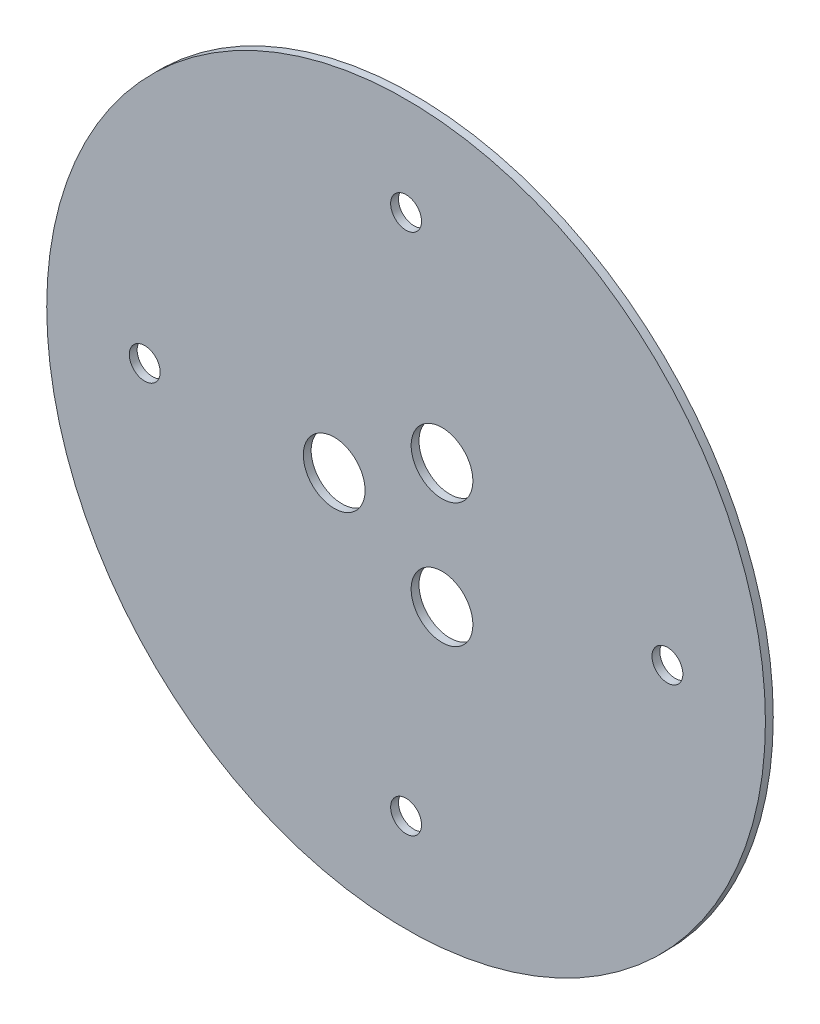
ISO-10303-21;
HEADER;
FILE_DESCRIPTION(('STEP AP214'),'2;1');
FILE_NAME('part.step','',(''),(''),'','','');
FILE_SCHEMA(('AUTOMOTIVE_DESIGN { 1 0 10303 214 1 1 1 1 }'));
ENDSEC;
DATA;
#1=APPLICATION_CONTEXT('core data for automotive mechanical design processes');
#2=APPLICATION_PROTOCOL_DEFINITION('international standard','automotive_design',2000,#1);
#3=PRODUCT_CONTEXT('',#1,'mechanical');
#4=PRODUCT('Part','Part','',(#3));
#5=PRODUCT_RELATED_PRODUCT_CATEGORY('part','',(#4));
#6=PRODUCT_DEFINITION_FORMATION('','',#4);
#7=PRODUCT_DEFINITION_CONTEXT('part definition',#1,'design');
#8=PRODUCT_DEFINITION('design','',#6,#7);
#9=PRODUCT_DEFINITION_SHAPE('','',#8);
#10=(LENGTH_UNIT() NAMED_UNIT(*) SI_UNIT(.MILLI.,.METRE.));
#11=(NAMED_UNIT(*) PLANE_ANGLE_UNIT() SI_UNIT($,.RADIAN.));
#12=(NAMED_UNIT(*) SI_UNIT($,.STERADIAN.) SOLID_ANGLE_UNIT());
#13=UNCERTAINTY_MEASURE_WITH_UNIT(LENGTH_MEASURE(1.E-05),#10,'distance_accuracy_value','');
#14=(GEOMETRIC_REPRESENTATION_CONTEXT(3) GLOBAL_UNCERTAINTY_ASSIGNED_CONTEXT((#13)) GLOBAL_UNIT_ASSIGNED_CONTEXT((#10,
#11,#12)) REPRESENTATION_CONTEXT('',''));
#15=CARTESIAN_POINT('',(0.,0.,0.));
#16=DIRECTION('',(0.,0.,1.));
#17=DIRECTION('',(1.,0.,0.));
#18=AXIS2_PLACEMENT_3D('',#15,#16,#17);
#19=CARTESIAN_POINT('',(0.,0.,1.524));
#20=DIRECTION('',(0.,0.,-1.));
#21=DIRECTION('',(-1.,0.,0.));
#22=AXIS2_PLACEMENT_3D('',#19,#20,#21);
#23=CYLINDRICAL_SURFACE('',#22,69.85);
#24=CARTESIAN_POINT('',(0.,0.,1.524));
#25=DIRECTION('',(0.,0.,1.));
#26=DIRECTION('',(1.,0.,0.));
#27=AXIS2_PLACEMENT_3D('',#24,#25,#26);
#28=CIRCLE('',#27,69.85);
#29=CARTESIAN_POINT('',(-69.85,0.,1.524));
#30=VERTEX_POINT('',#29);
#31=EDGE_CURVE('E10',#30,#30,#28,.T.);
#32=CARTESIAN_POINT('',(0.,0.,0.));
#33=DIRECTION('',(0.,0.,1.));
#34=DIRECTION('',(1.,0.,0.));
#35=AXIS2_PLACEMENT_3D('',#32,#33,#34);
#36=CIRCLE('',#35,69.85);
#37=CARTESIAN_POINT('',(-69.85,0.,0.));
#38=VERTEX_POINT('',#37);
#39=EDGE_CURVE('E48',#38,#38,#36,.T.);
#40=CARTESIAN_POINT('',(-69.85,0.,1.524));
#41=CARTESIAN_POINT('',(-69.85,0.,1.508125));
#42=CARTESIAN_POINT('',(-69.85,0.,1.49225));
#43=CARTESIAN_POINT('',(-69.85,0.,1.4605));
#44=CARTESIAN_POINT('',(-69.85,0.,1.444625));
#45=CARTESIAN_POINT('',(-69.85,0.,1.412875));
#46=CARTESIAN_POINT('',(-69.85,0.,1.397));
#47=CARTESIAN_POINT('',(-69.85,0.,1.36525));
#48=CARTESIAN_POINT('',(-69.85,0.,1.349375));
#49=CARTESIAN_POINT('',(-69.85,0.,1.317625));
#50=CARTESIAN_POINT('',(-69.85,0.,1.30175));
#51=CARTESIAN_POINT('',(-69.85,0.,1.27));
#52=CARTESIAN_POINT('',(-69.85,0.,1.254125));
#53=CARTESIAN_POINT('',(-69.85,0.,1.222375));
#54=CARTESIAN_POINT('',(-69.85,0.,1.2065));
#55=CARTESIAN_POINT('',(-69.85,0.,1.17475));
#56=CARTESIAN_POINT('',(-69.85,0.,1.158875));
#57=CARTESIAN_POINT('',(-69.85,0.,1.127125));
#58=CARTESIAN_POINT('',(-69.85,0.,1.11125));
#59=CARTESIAN_POINT('',(-69.85,0.,1.0795));
#60=CARTESIAN_POINT('',(-69.85,0.,1.063625));
#61=CARTESIAN_POINT('',(-69.85,0.,1.031875));
#62=CARTESIAN_POINT('',(-69.85,0.,1.016));
#63=CARTESIAN_POINT('',(-69.85,0.,0.98425));
#64=CARTESIAN_POINT('',(-69.85,0.,0.968375));
#65=CARTESIAN_POINT('',(-69.85,0.,0.936625));
#66=CARTESIAN_POINT('',(-69.85,0.,0.92075));
#67=CARTESIAN_POINT('',(-69.85,0.,0.889));
#68=CARTESIAN_POINT('',(-69.85,0.,0.873125));
#69=CARTESIAN_POINT('',(-69.85,0.,0.841375));
#70=CARTESIAN_POINT('',(-69.85,0.,0.8255));
#71=CARTESIAN_POINT('',(-69.85,0.,0.79375));
#72=CARTESIAN_POINT('',(-69.85,0.,0.777875));
#73=CARTESIAN_POINT('',(-69.85,0.,0.746125));
#74=CARTESIAN_POINT('',(-69.85,0.,0.73025));
#75=CARTESIAN_POINT('',(-69.85,0.,0.6985));
#76=CARTESIAN_POINT('',(-69.85,0.,0.682625));
#77=CARTESIAN_POINT('',(-69.85,0.,0.650875));
#78=CARTESIAN_POINT('',(-69.85,0.,0.635));
#79=CARTESIAN_POINT('',(-69.85,0.,0.60325));
#80=CARTESIAN_POINT('',(-69.85,0.,0.587375));
#81=CARTESIAN_POINT('',(-69.85,0.,0.555625));
#82=CARTESIAN_POINT('',(-69.85,0.,0.53975));
#83=CARTESIAN_POINT('',(-69.85,0.,0.508));
#84=CARTESIAN_POINT('',(-69.85,0.,0.492125));
#85=CARTESIAN_POINT('',(-69.85,0.,0.460375));
#86=CARTESIAN_POINT('',(-69.85,0.,0.4445));
#87=CARTESIAN_POINT('',(-69.85,0.,0.41275));
#88=CARTESIAN_POINT('',(-69.85,0.,0.396875));
#89=CARTESIAN_POINT('',(-69.85,0.,0.365125));
#90=CARTESIAN_POINT('',(-69.85,0.,0.34925));
#91=CARTESIAN_POINT('',(-69.85,0.,0.3175));
#92=CARTESIAN_POINT('',(-69.85,0.,0.301625));
#93=CARTESIAN_POINT('',(-69.85,0.,0.269875));
#94=CARTESIAN_POINT('',(-69.85,0.,0.254));
#95=CARTESIAN_POINT('',(-69.85,0.,0.22225));
#96=CARTESIAN_POINT('',(-69.85,0.,0.206375));
#97=CARTESIAN_POINT('',(-69.85,0.,0.174625));
#98=CARTESIAN_POINT('',(-69.85,0.,0.15875));
#99=CARTESIAN_POINT('',(-69.85,0.,0.127));
#100=CARTESIAN_POINT('',(-69.85,0.,0.111125));
#101=CARTESIAN_POINT('',(-69.85,0.,0.079375));
#102=CARTESIAN_POINT('',(-69.85,0.,0.0635));
#103=CARTESIAN_POINT('',(-69.85,0.,0.0317499999999999));
#104=CARTESIAN_POINT('',(-69.85,0.,0.015875));
#105=CARTESIAN_POINT('',(-69.85,0.,0.));
#106=B_SPLINE_CURVE_WITH_KNOTS('',3,(#40,#41,#42,#43,#44,#45,#46,#47,#48,#49,#50,#51,#52,#53,
#54,#55,#56,#57,#58,#59,#60,#61,#62,#63,#64,#65,#66,#67,#68,#69,#70,#71,#72,#73,#74,#75,#76,#77,
#78,#79,#80,#81,#82,#83,#84,#85,#86,#87,#88,#89,#90,#91,#92,#93,#94,#95,#96,#97,#98,#99,#100,
#101,#102,#103,#104,#105),.UNSPECIFIED.,.F.,.F.,(4,2,2,2,2,2,2,2,2,2,2,2,2,2,2,2,2,2,2,2,2,2,2,
2,2,2,2,2,2,2,2,2,4),(0.,0.0476249999999999,0.0952499999999998,0.142875,0.1905,0.238125,0.28575,
0.333375,0.381,0.428625,0.47625,0.523875,0.5715,0.619125,0.66675,0.714375,0.762,0.809625,
0.85725,0.904875,0.9525,1.000125,1.04775,1.095375,1.143,1.190625,1.23825,1.285875,1.3335,
1.381125,1.42875,1.476375,1.524),.UNSPECIFIED.);
#107=EDGE_CURVE('BSEAM41',#30,#38,#106,.T.);
#108=ORIENTED_EDGE('',*,*,#31,.F.);
#109=ORIENTED_EDGE('',*,*,#39,.T.);
#110=ORIENTED_EDGE('',*,*,#107,.T.);
#111=ORIENTED_EDGE('',*,*,#107,.F.);
#112=EDGE_LOOP('',(#108,#110,#109,#111));
#113=FACE_BOUND('',#112,.T.);
#114=ADVANCED_FACE('F41',(#113),#23,.T.);
#115=CARTESIAN_POINT('',(0.,0.,1.524));
#116=DIRECTION('',(0.,0.,1.));
#117=DIRECTION('',(1.,0.,0.));
#118=AXIS2_PLACEMENT_3D('',#115,#116,#117);
#119=PLANE('',#118);
#120=CARTESIAN_POINT('',(-1.77367252013231E-13,-50.8,1.524));
#121=DIRECTION('',(0.,0.,1.));
#122=DIRECTION('',(0.,-1.,0.));
#123=AXIS2_PLACEMENT_3D('',#120,#121,#122);
#124=CIRCLE('',#123,3.);
#125=CARTESIAN_POINT('',(-1.87841696029761E-13,-53.8,1.524));
#126=VERTEX_POINT('',#125);
#127=EDGE_CURVE('E146',#126,#126,#124,.T.);
#128=ORIENTED_EDGE('',*,*,#127,.F.);
#129=EDGE_LOOP('',(#128));
#130=FACE_BOUND('',#129,.T.);
#131=CARTESIAN_POINT('',(-50.8,0.,1.524));
#132=DIRECTION('',(0.,0.,1.));
#133=DIRECTION('',(-1.,0.,0.));
#134=AXIS2_PLACEMENT_3D('',#131,#132,#133);
#135=CIRCLE('',#134,3.);
#136=CARTESIAN_POINT('',(-53.8,0.,1.524));
#137=VERTEX_POINT('',#136);
#138=EDGE_CURVE('E141',#137,#137,#135,.T.);
#139=ORIENTED_EDGE('',*,*,#138,.F.);
#140=EDGE_LOOP('',(#139));
#141=FACE_BOUND('',#140,.T.);
#142=CARTESIAN_POINT('',(5.32101756039693E-13,50.8,1.524));
#143=DIRECTION('',(0.,0.,1.));
#144=DIRECTION('',(0.,1.,0.));
#145=AXIS2_PLACEMENT_3D('',#142,#143,#144);
#146=CIRCLE('',#145,3.);
#147=CARTESIAN_POINT('',(5.63525088089282E-13,53.8,1.524));
#148=VERTEX_POINT('',#147);
#149=EDGE_CURVE('E142',#148,#148,#146,.T.);
#150=ORIENTED_EDGE('',*,*,#149,.F.);
#151=EDGE_LOOP('',(#150));
#152=FACE_BOUND('',#151,.T.);
#153=CARTESIAN_POINT('',(50.8,0.,1.524));
#154=DIRECTION('',(0.,0.,1.));
#155=DIRECTION('',(1.,0.,0.));
#156=AXIS2_PLACEMENT_3D('',#153,#154,#155);
#157=CIRCLE('',#156,3.);
#158=CARTESIAN_POINT('',(53.8,0.,1.524));
#159=VERTEX_POINT('',#158);
#160=EDGE_CURVE('E121',#159,#159,#157,.T.);
#161=ORIENTED_EDGE('',*,*,#160,.F.);
#162=EDGE_LOOP('',(#161));
#163=FACE_BOUND('',#162,.T.);
#164=CARTESIAN_POINT('',(-13.97,0.,1.524));
#165=DIRECTION('',(0.,0.,1.));
#166=DIRECTION('',(1.,0.,0.));
#167=AXIS2_PLACEMENT_3D('',#164,#165,#166);
#168=CIRCLE('',#167,6.);
#169=CARTESIAN_POINT('',(-7.97,0.,1.524));
#170=VERTEX_POINT('',#169);
#171=EDGE_CURVE('E61',#170,#170,#168,.T.);
#172=ORIENTED_EDGE('',*,*,#171,.F.);
#173=EDGE_LOOP('',(#172));
#174=FACE_BOUND('',#173,.T.);
#175=CARTESIAN_POINT('',(6.985,12.0983748908686,1.524));
#176=DIRECTION('',(0.,0.,1.));
#177=DIRECTION('',(1.,0.,0.));
#178=AXIS2_PLACEMENT_3D('',#175,#176,#177);
#179=CIRCLE('',#178,6.);
#180=CARTESIAN_POINT('',(12.985,12.0983748908686,1.524));
#181=VERTEX_POINT('',#180);
#182=EDGE_CURVE('E124',#181,#181,#179,.T.);
#183=ORIENTED_EDGE('',*,*,#182,.F.);
#184=EDGE_LOOP('',(#183));
#185=FACE_BOUND('',#184,.T.);
#186=CARTESIAN_POINT('',(6.985,-12.0983748908686,1.524));
#187=DIRECTION('',(0.,0.,1.));
#188=DIRECTION('',(1.,0.,0.));
#189=AXIS2_PLACEMENT_3D('',#186,#187,#188);
#190=CIRCLE('',#189,6.);
#191=CARTESIAN_POINT('',(12.985,-12.0983748908686,1.524));
#192=VERTEX_POINT('',#191);
#193=EDGE_CURVE('E55',#192,#192,#190,.T.);
#194=ORIENTED_EDGE('',*,*,#193,.F.);
#195=EDGE_LOOP('',(#194));
#196=FACE_BOUND('',#195,.T.);
#197=ORIENTED_EDGE('',*,*,#31,.T.);
#198=EDGE_LOOP('',(#197));
#199=FACE_BOUND('',#198,.T.);
#200=ADVANCED_FACE('F88',(#130,#141,#152,#163,#174,#185,#196,#199),#119,.T.);
#201=CARTESIAN_POINT('',(0.,0.,0.));
#202=DIRECTION('',(0.,0.,1.));
#203=DIRECTION('',(1.,0.,0.));
#204=AXIS2_PLACEMENT_3D('',#201,#202,#203);
#205=PLANE('',#204);
#206=CARTESIAN_POINT('',(-1.77367252013231E-13,-50.8,0.));
#207=DIRECTION('',(0.,0.,1.));
#208=DIRECTION('',(1.,0.,0.));
#209=AXIS2_PLACEMENT_3D('',#206,#207,#208);
#210=CIRCLE('',#209,3.);
#211=CARTESIAN_POINT('',(2.99999999999982,-50.8,0.));
#212=VERTEX_POINT('',#211);
#213=EDGE_CURVE('E108',#212,#212,#210,.F.);
#214=ORIENTED_EDGE('',*,*,#213,.F.);
#215=EDGE_LOOP('',(#214));
#216=FACE_BOUND('',#215,.T.);
#217=CARTESIAN_POINT('',(-50.8,0.,0.));
#218=DIRECTION('',(0.,0.,1.));
#219=DIRECTION('',(1.,0.,0.));
#220=AXIS2_PLACEMENT_3D('',#217,#218,#219);
#221=CIRCLE('',#220,3.);
#222=CARTESIAN_POINT('',(-47.8,0.,0.));
#223=VERTEX_POINT('',#222);
#224=EDGE_CURVE('E112',#223,#223,#221,.F.);
#225=ORIENTED_EDGE('',*,*,#224,.F.);
#226=EDGE_LOOP('',(#225));
#227=FACE_BOUND('',#226,.T.);
#228=CARTESIAN_POINT('',(5.32101756039693E-13,50.8,0.));
#229=DIRECTION('',(0.,0.,1.));
#230=DIRECTION('',(1.,0.,0.));
#231=AXIS2_PLACEMENT_3D('',#228,#229,#230);
#232=CIRCLE('',#231,3.);
#233=CARTESIAN_POINT('',(3.00000000000053,50.8,0.));
#234=VERTEX_POINT('',#233);
#235=EDGE_CURVE('E116',#234,#234,#232,.F.);
#236=ORIENTED_EDGE('',*,*,#235,.F.);
#237=EDGE_LOOP('',(#236));
#238=FACE_BOUND('',#237,.T.);
#239=CARTESIAN_POINT('',(50.8,0.,0.));
#240=DIRECTION('',(0.,0.,1.));
#241=DIRECTION('',(1.,0.,0.));
#242=AXIS2_PLACEMENT_3D('',#239,#240,#241);
#243=CIRCLE('',#242,3.);
#244=CARTESIAN_POINT('',(53.8,0.,0.));
#245=VERTEX_POINT('',#244);
#246=EDGE_CURVE('E119',#245,#245,#243,.F.);
#247=ORIENTED_EDGE('',*,*,#246,.F.);
#248=EDGE_LOOP('',(#247));
#249=FACE_BOUND('',#248,.T.);
#250=CARTESIAN_POINT('',(-13.97,0.,0.));
#251=DIRECTION('',(0.,0.,1.));
#252=DIRECTION('',(1.,0.,0.));
#253=AXIS2_PLACEMENT_3D('',#250,#251,#252);
#254=CIRCLE('',#253,6.);
#255=CARTESIAN_POINT('',(-7.97,0.,0.));
#256=VERTEX_POINT('',#255);
#257=EDGE_CURVE('E44',#256,#256,#254,.T.);
#258=ORIENTED_EDGE('',*,*,#257,.T.);
#259=EDGE_LOOP('',(#258));
#260=FACE_BOUND('',#259,.T.);
#261=CARTESIAN_POINT('',(6.985,12.0983748908686,0.));
#262=DIRECTION('',(0.,0.,1.));
#263=DIRECTION('',(1.,0.,0.));
#264=AXIS2_PLACEMENT_3D('',#261,#262,#263);
#265=CIRCLE('',#264,6.);
#266=CARTESIAN_POINT('',(12.985,12.0983748908686,0.));
#267=VERTEX_POINT('',#266);
#268=EDGE_CURVE('E60',#267,#267,#265,.T.);
#269=ORIENTED_EDGE('',*,*,#268,.T.);
#270=EDGE_LOOP('',(#269));
#271=FACE_BOUND('',#270,.T.);
#272=CARTESIAN_POINT('',(6.985,-12.0983748908686,0.));
#273=DIRECTION('',(0.,0.,1.));
#274=DIRECTION('',(1.,0.,0.));
#275=AXIS2_PLACEMENT_3D('',#272,#273,#274);
#276=CIRCLE('',#275,6.);
#277=CARTESIAN_POINT('',(12.985,-12.0983748908686,0.));
#278=VERTEX_POINT('',#277);
#279=EDGE_CURVE('E58',#278,#278,#276,.T.);
#280=ORIENTED_EDGE('',*,*,#279,.T.);
#281=EDGE_LOOP('',(#280));
#282=FACE_BOUND('',#281,.T.);
#283=ORIENTED_EDGE('',*,*,#39,.F.);
#284=EDGE_LOOP('',(#283));
#285=FACE_BOUND('',#284,.T.);
#286=ADVANCED_FACE('F68',(#216,#227,#238,#249,#260,#271,#282,#285),#205,.F.);
#287=CARTESIAN_POINT('',(6.985,-12.0983748908686,-0.476));
#288=DIRECTION('',(0.,0.,1.));
#289=DIRECTION('',(1.,0.,0.));
#290=AXIS2_PLACEMENT_3D('',#287,#288,#289);
#291=CYLINDRICAL_SURFACE('',#290,6.);
#292=ORIENTED_EDGE('',*,*,#193,.T.);
#293=EDGE_LOOP('',(#292));
#294=FACE_BOUND('',#293,.T.);
#295=ORIENTED_EDGE('',*,*,#279,.F.);
#296=EDGE_LOOP('',(#295));
#297=FACE_BOUND('',#296,.T.);
#298=ADVANCED_FACE('F83',(#294,#297),#291,.F.);
#299=CARTESIAN_POINT('',(6.985,12.0983748908686,-0.476));
#300=DIRECTION('',(0.,0.,1.));
#301=DIRECTION('',(1.,0.,0.));
#302=AXIS2_PLACEMENT_3D('',#299,#300,#301);
#303=CYLINDRICAL_SURFACE('',#302,6.);
#304=ORIENTED_EDGE('',*,*,#182,.T.);
#305=EDGE_LOOP('',(#304));
#306=FACE_BOUND('',#305,.T.);
#307=ORIENTED_EDGE('',*,*,#268,.F.);
#308=EDGE_LOOP('',(#307));
#309=FACE_BOUND('',#308,.T.);
#310=ADVANCED_FACE('F73',(#306,#309),#303,.F.);
#311=CARTESIAN_POINT('',(-13.97,0.,-0.476));
#312=DIRECTION('',(0.,0.,1.));
#313=DIRECTION('',(1.,0.,0.));
#314=AXIS2_PLACEMENT_3D('',#311,#312,#313);
#315=CYLINDRICAL_SURFACE('',#314,6.);
#316=ORIENTED_EDGE('',*,*,#171,.T.);
#317=EDGE_LOOP('',(#316));
#318=FACE_BOUND('',#317,.T.);
#319=ORIENTED_EDGE('',*,*,#257,.F.);
#320=EDGE_LOOP('',(#319));
#321=FACE_BOUND('',#320,.T.);
#322=ADVANCED_FACE('F70',(#318,#321),#315,.F.);
#323=CARTESIAN_POINT('',(50.8,0.,-0.000999999999999916));
#324=DIRECTION('',(0.,0.,1.));
#325=DIRECTION('',(1.,0.,0.));
#326=AXIS2_PLACEMENT_3D('',#323,#324,#325);
#327=CYLINDRICAL_SURFACE('',#326,3.);
#328=ORIENTED_EDGE('',*,*,#160,.T.);
#329=EDGE_LOOP('',(#328));
#330=FACE_BOUND('',#329,.T.);
#331=ORIENTED_EDGE('',*,*,#246,.T.);
#332=EDGE_LOOP('',(#331));
#333=FACE_BOUND('',#332,.T.);
#334=ADVANCED_FACE('F72',(#330,#333),#327,.F.);
#335=CARTESIAN_POINT('',(5.32101756039693E-13,50.8,-0.000999999999999916));
#336=DIRECTION('',(0.,0.,1.));
#337=DIRECTION('',(1.,0.,0.));
#338=AXIS2_PLACEMENT_3D('',#335,#336,#337);
#339=CYLINDRICAL_SURFACE('',#338,3.);
#340=ORIENTED_EDGE('',*,*,#149,.T.);
#341=EDGE_LOOP('',(#340));
#342=FACE_BOUND('',#341,.T.);
#343=ORIENTED_EDGE('',*,*,#235,.T.);
#344=EDGE_LOOP('',(#343));
#345=FACE_BOUND('',#344,.T.);
#346=ADVANCED_FACE('F80',(#342,#345),#339,.F.);
#347=CARTESIAN_POINT('',(-50.8,0.,-0.000999999999999916));
#348=DIRECTION('',(0.,0.,1.));
#349=DIRECTION('',(1.,0.,0.));
#350=AXIS2_PLACEMENT_3D('',#347,#348,#349);
#351=CYLINDRICAL_SURFACE('',#350,3.);
#352=ORIENTED_EDGE('',*,*,#138,.T.);
#353=EDGE_LOOP('',(#352));
#354=FACE_BOUND('',#353,.T.);
#355=ORIENTED_EDGE('',*,*,#224,.T.);
#356=EDGE_LOOP('',(#355));
#357=FACE_BOUND('',#356,.T.);
#358=ADVANCED_FACE('F164',(#354,#357),#351,.F.);
#359=CARTESIAN_POINT('',(-1.77367252013231E-13,-50.8,-0.000999999999999916));
#360=DIRECTION('',(0.,0.,1.));
#361=DIRECTION('',(1.,0.,0.));
#362=AXIS2_PLACEMENT_3D('',#359,#360,#361);
#363=CYLINDRICAL_SURFACE('',#362,3.);
#364=ORIENTED_EDGE('',*,*,#127,.T.);
#365=EDGE_LOOP('',(#364));
#366=FACE_BOUND('',#365,.T.);
#367=ORIENTED_EDGE('',*,*,#213,.T.);
#368=EDGE_LOOP('',(#367));
#369=FACE_BOUND('',#368,.T.);
#370=ADVANCED_FACE('F153',(#366,#369),#363,.F.);
#371=CLOSED_SHELL('',(#114,#200,#286,#298,#310,#322,#334,#346,#358,#370));
#372=MANIFOLD_SOLID_BREP('B2',#371);
#373=ADVANCED_BREP_SHAPE_REPRESENTATION('',(#18,#372),#14);
#374=SHAPE_DEFINITION_REPRESENTATION(#9,#373);
ENDSEC;
END-ISO-10303-21;
